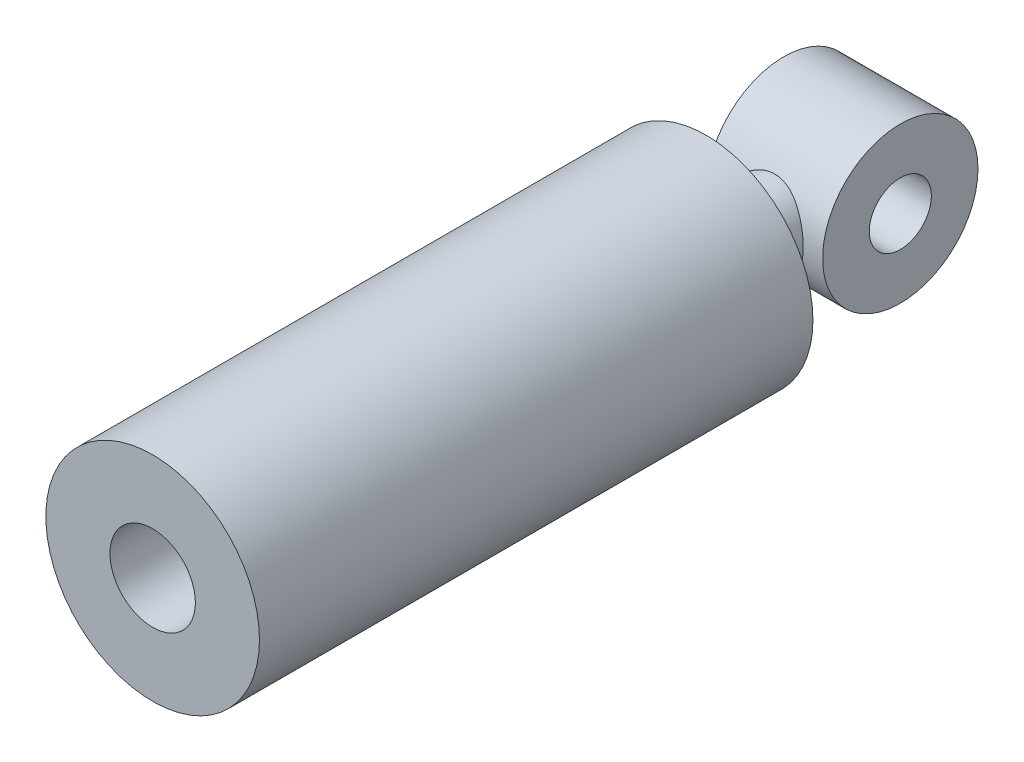
ISO-10303-21;
HEADER;
FILE_DESCRIPTION(('STEP AP214'),'2;1');
FILE_NAME('part.step','',(''),(''),'','','');
FILE_SCHEMA(('AUTOMOTIVE_DESIGN { 1 0 10303 214 1 1 1 1 }'));
ENDSEC;
DATA;
#1=APPLICATION_CONTEXT('core data for automotive mechanical design processes');
#2=APPLICATION_PROTOCOL_DEFINITION('international standard','automotive_design',2000,#1);
#3=PRODUCT_CONTEXT('',#1,'mechanical');
#4=PRODUCT('Part','Part','',(#3));
#5=PRODUCT_RELATED_PRODUCT_CATEGORY('part','',(#4));
#6=PRODUCT_DEFINITION_FORMATION('','',#4);
#7=PRODUCT_DEFINITION_CONTEXT('part definition',#1,'design');
#8=PRODUCT_DEFINITION('design','',#6,#7);
#9=PRODUCT_DEFINITION_SHAPE('','',#8);
#10=(LENGTH_UNIT() NAMED_UNIT(*) SI_UNIT(.MILLI.,.METRE.));
#11=(NAMED_UNIT(*) PLANE_ANGLE_UNIT() SI_UNIT($,.RADIAN.));
#12=(NAMED_UNIT(*) SI_UNIT($,.STERADIAN.) SOLID_ANGLE_UNIT());
#13=UNCERTAINTY_MEASURE_WITH_UNIT(LENGTH_MEASURE(1.E-05),#10,'distance_accuracy_value','');
#14=(GEOMETRIC_REPRESENTATION_CONTEXT(3) GLOBAL_UNCERTAINTY_ASSIGNED_CONTEXT((#13)) GLOBAL_UNIT_ASSIGNED_CONTEXT((#10,
#11,#12)) REPRESENTATION_CONTEXT('',''));
#15=CARTESIAN_POINT('',(0.,0.,0.));
#16=DIRECTION('',(0.,0.,1.));
#17=DIRECTION('',(1.,0.,0.));
#18=AXIS2_PLACEMENT_3D('',#15,#16,#17);
#19=CARTESIAN_POINT('',(0.,0.,10.123));
#20=DIRECTION('',(0.,0.,1.));
#21=DIRECTION('',(1.,0.,0.));
#22=AXIS2_PLACEMENT_3D('',#19,#20,#21);
#23=CYLINDRICAL_SURFACE('',#22,2.);
#24=CARTESIAN_POINT('',(0.,0.,7.));
#25=DIRECTION('',(0.,0.,1.));
#26=DIRECTION('',(1.,0.,0.));
#27=AXIS2_PLACEMENT_3D('',#24,#25,#26);
#28=CIRCLE('',#27,2.);
#29=CARTESIAN_POINT('',(2.,0.,7.));
#30=VERTEX_POINT('',#29);
#31=EDGE_CURVE('E10',#30,#30,#28,.T.);
#32=ORIENTED_EDGE('',*,*,#31,.F.);
#33=EDGE_LOOP('',(#32));
#34=FACE_BOUND('',#33,.T.);
#35=CARTESIAN_POINT('',(2.,0.,4.));
#36=CARTESIAN_POINT('',(1.99999339536562,0.105143925902467,3.99999426810082));
#37=CARTESIAN_POINT('',(1.99165985375789,0.210413199395125,3.99580982039513));
#38=CARTESIAN_POINT('',(1.95869423931692,0.417840470537792,3.97948312074314));
#39=CARTESIAN_POINT('',(1.93403121400437,0.519992173427259,3.96732575657839));
#40=CARTESIAN_POINT('',(1.86961238276674,0.717867089760898,3.93632558806751));
#41=CARTESIAN_POINT('',(1.82991523150406,0.813613605878292,3.91750878355075));
#42=CARTESIAN_POINT('',(1.73685875727003,0.996945233613197,3.87491553031523));
#43=CARTESIAN_POINT('',(1.68350051150227,1.08453098798012,3.8511394726705));
#44=CARTESIAN_POINT('',(1.56096550102943,1.25501563552382,3.79912516516124));
#45=CARTESIAN_POINT('',(1.49102704152072,1.33731042224422,3.77070398255074));
#46=CARTESIAN_POINT('',(1.33895704150593,1.48955888973396,3.71319940493486));
#47=CARTESIAN_POINT('',(1.25681629645512,1.55950316621353,3.68411552418069));
#48=CARTESIAN_POINT('',(1.07503330095324,1.69050400090056,3.62597902394695));
#49=CARTESIAN_POINT('',(0.974527803308175,1.75045067110327,3.59710373940264));
#50=CARTESIAN_POINT('',(0.763265328027571,1.85233645378139,3.54571957544641));
#51=CARTESIAN_POINT('',(0.652515742554502,1.89428842993267,3.52320615213979));
#52=CARTESIAN_POINT('',(0.430669789156155,1.95626488437718,3.48915734075617));
#53=CARTESIAN_POINT('',(0.319991095865212,1.97745171416088,3.47704543167427));
#54=CARTESIAN_POINT('',(0.0960423244410466,2.00085398661769,3.46363779897055));
#55=CARTESIAN_POINT('',(-0.0172250817423092,2.00308817674615,3.46233138686576));
#56=CARTESIAN_POINT('',(-0.228572048630736,1.98937457434459,3.47021860514497));
#57=CARTESIAN_POINT('',(-0.3268480624461,1.97556911907364,3.47817527324027));
#58=CARTESIAN_POINT('',(-0.519443818746084,1.93387969811386,3.50152457467701));
#59=CARTESIAN_POINT('',(-0.613762290610631,1.9059912477953,3.51691957663553));
#60=CARTESIAN_POINT('',(-0.798458265131318,1.83641956077201,3.55374952825482));
#61=CARTESIAN_POINT('',(-0.888692797571577,1.79443013423199,3.57531681327997));
#62=CARTESIAN_POINT('',(-1.06126858518002,1.698083375336,3.62206808562807));
#63=CARTESIAN_POINT('',(-1.14360627120018,1.64372048762493,3.64725369560381));
#64=CARTESIAN_POINT('',(-1.30904250548645,1.51613210982558,3.70226315806572));
#65=CARTESIAN_POINT('',(-1.39091374715231,1.44138891673856,3.73227020473492));
#66=CARTESIAN_POINT('',(-1.5414708371818,1.27911115748275,3.79095246600814));
#67=CARTESIAN_POINT('',(-1.61015038406777,1.19157051314857,3.81962703917602));
#68=CARTESIAN_POINT('',(-1.73537132205945,1.0010330116637,3.87403974565928));
#69=CARTESIAN_POINT('',(-1.79120094489148,0.897507183198818,3.89957968324015));
#70=CARTESIAN_POINT('',(-1.88419405808602,0.680932430977594,3.94315762242485));
#71=CARTESIAN_POINT('',(-1.92137237003033,0.567891152530552,3.96120157887106));
#72=CARTESIAN_POINT('',(-1.97295080743335,0.345532983321405,3.98648667482871));
#73=CARTESIAN_POINT('',(-1.98898247149356,0.236683061096652,3.9944987660262));
#74=CARTESIAN_POINT('',(-2.00292946226897,0.0175591998987033,4.00146026918207));
#75=CARTESIAN_POINT('',(-2.00085337127894,-0.0927140397398172,4.00041397442637));
#76=CARTESIAN_POINT('',(-1.97958662316251,-0.302465943971974,3.9898238450687));
#77=CARTESIAN_POINT('',(-1.96173493454001,-0.40211881609986,3.98094491376337));
#78=CARTESIAN_POINT('',(-1.91152385620976,-0.596813784603882,3.9564434262968));
#79=CARTESIAN_POINT('',(-1.87916286709301,-0.691855371382174,3.94082012668824));
#80=CARTESIAN_POINT('',(-1.80000306713393,-0.877777216899145,3.90368502827176));
#81=CARTESIAN_POINT('',(-1.75281789976743,-0.968460794011607,3.88201763539261));
#82=CARTESIAN_POINT('',(-1.64578492870686,-1.14092272339854,3.83487948634835));
#83=CARTESIAN_POINT('',(-1.58593173080921,-1.22269725955318,3.80940711133877));
#84=CARTESIAN_POINT('',(-1.44847914933857,-1.38353537857843,3.75416442672396));
#85=CARTESIAN_POINT('',(-1.36971426310971,-1.46154415563805,3.72421769686998));
#86=CARTESIAN_POINT('',(-1.20014969744454,-1.60371264223771,3.6652478321764));
#87=CARTESIAN_POINT('',(-1.10934176230416,-1.66786277142375,3.63622534800094));
#88=CARTESIAN_POINT('',(-0.912712691654048,-1.78341582895804,3.58102384412979));
#89=CARTESIAN_POINT('',(-0.806377467811037,-1.8340509916005,3.55505059178121));
#90=CARTESIAN_POINT('',(-0.584979864850068,-1.91616565186941,3.51148144588269));
#91=CARTESIAN_POINT('',(-0.469928947066219,-1.94766983173403,3.493874764435));
#92=CARTESIAN_POINT('',(-0.246179554230592,-1.98772337493374,3.47123002051604));
#93=CARTESIAN_POINT('',(-0.137931493129517,-1.9981859928109,3.4651476693013));
#94=CARTESIAN_POINT('',(0.0788941343290494,-2.0013783087524,3.46330709283206));
#95=CARTESIAN_POINT('',(0.187471537475723,-1.99411569324648,3.4675443925278));
#96=CARTESIAN_POINT('',(0.390967003066874,-1.96385225118662,3.48475724102153));
#97=CARTESIAN_POINT('',(0.486200940289479,-1.94241662868607,3.49686188965317));
#98=CARTESIAN_POINT('',(0.671616238848733,-1.88635071644882,3.52742032375305));
#99=CARTESIAN_POINT('',(0.761795964184063,-1.85171618231984,3.54587615139337));
#100=CARTESIAN_POINT('',(0.941249701973074,-1.76763149060113,3.58857060729071));
#101=CARTESIAN_POINT('',(1.03005580365806,-1.7173422756314,3.61311444791841));
#102=CARTESIAN_POINT('',(1.19854907236252,-1.60430194327478,3.66470663269721));
#103=CARTESIAN_POINT('',(1.27823146104222,-1.54154434248312,3.69175627591221));
#104=CARTESIAN_POINT('',(1.43628396470935,-1.39640665332275,3.74924646316184));
#105=CARTESIAN_POINT('',(1.51331820470058,-1.31256884599452,3.77969966613256));
#106=CARTESIAN_POINT('',(1.65252596687054,-1.13230961246639,3.83755504519861));
#107=CARTESIAN_POINT('',(1.71469147893981,-1.03588144661039,3.8649555725239));
#108=CARTESIAN_POINT('',(1.82247272542414,-0.831863193565891,3.91396019133075));
#109=CARTESIAN_POINT('',(1.86796833847294,-0.72419900755346,3.93552192987866));
#110=CARTESIAN_POINT('',(1.93961633551482,-0.501484202276172,3.97002682597974));
#111=CARTESIAN_POINT('',(1.96582369361143,-0.3864555991782,3.98299446726136));
#112=CARTESIAN_POINT('',(1.98779482217148,-0.22520389298179,3.99390923826956));
#113=CARTESIAN_POINT('',(1.99236528173268,-0.18032375888313,3.99618730680502));
#114=CARTESIAN_POINT('',(1.99846933102817,-0.0903034636101831,3.99923393953631));
#115=CARTESIAN_POINT('',(2.00000283694042,-0.0451632952932568,4.00000246206762));
#116=CARTESIAN_POINT('',(2.,0.,4.));
#117=B_SPLINE_CURVE_WITH_KNOTS('',3,(#35,#36,#37,#38,#39,#40,#41,#42,#43,#44,#45,#46,#47,#48,
#49,#50,#51,#52,#53,#54,#55,#56,#57,#58,#59,#60,#61,#62,#63,#64,#65,#66,#67,#68,#69,#70,#71,#72,
#73,#74,#75,#76,#77,#78,#79,#80,#81,#82,#83,#84,#85,#86,#87,#88,#89,#90,#91,#92,#93,#94,#95,#96,
#97,#98,#99,#100,#101,#102,#103,#104,#105,#106,#107,#108,#109,#110,#111,#112,#113,#114,#115,
#116),.UNSPECIFIED.,.T.,.F.,(4,2,2,2,2,2,2,2,2,2,2,2,2,2,2,2,2,2,2,2,2,2,2,2,2,2,2,2,2,2,2,2,2,
2,2,2,2,2,2,2,4),(0.,0.315248514840585,0.631096299418395,0.945724310984597,1.26032752116314,
1.59396351743618,1.92785247530807,2.28763452861505,2.64715895796562,2.98516024280459,
3.32282714658041,3.62011424818641,3.91749607851357,4.22180480336975,4.52625042520444,
4.86929882667757,5.21251069197373,5.57166044428881,5.93052433824559,6.25966580942691,
6.58865129022952,6.89213813012244,7.19565843261863,7.50785712055797,7.82018901496679,
8.16319221288838,8.50643177230864,8.86629364323452,9.22569023890902,9.55058615006093,
9.87534119729357,10.1691586049771,10.463070575767,10.7767291356057,11.0905512228726,
11.4425048551434,11.7946476676249,12.1492802732705,12.502898172423,12.6383056026783,
12.7737167702213),.UNSPECIFIED.);
#118=CARTESIAN_POINT('',(2.,0.,4.));
#119=VERTEX_POINT('',#118);
#120=EDGE_CURVE('E40',#119,#119,#117,.T.);
#121=ORIENTED_EDGE('',*,*,#120,.T.);
#122=EDGE_LOOP('',(#121));
#123=FACE_BOUND('',#122,.T.);
#124=ADVANCED_FACE('F36',(#34,#123),#23,.T.);
#125=CARTESIAN_POINT('',(2.,0.,7.));
#126=DIRECTION('',(0.,0.,-1.));
#127=DIRECTION('',(-1.,0.,0.));
#128=AXIS2_PLACEMENT_3D('',#125,#126,#127);
#129=PLANE('',#128);
#130=ORIENTED_EDGE('',*,*,#31,.T.);
#131=EDGE_LOOP('',(#130));
#132=FACE_BOUND('',#131,.T.);
#133=CARTESIAN_POINT('',(0.,0.,7.));
#134=DIRECTION('',(0.,0.,1.));
#135=DIRECTION('',(1.,0.,0.));
#136=AXIS2_PLACEMENT_3D('',#133,#134,#135);
#137=CIRCLE('',#136,5.5);
#138=CARTESIAN_POINT('',(5.5,0.,7.));
#139=VERTEX_POINT('',#138);
#140=EDGE_CURVE('E48',#139,#139,#137,.T.);
#141=ORIENTED_EDGE('',*,*,#140,.F.);
#142=EDGE_LOOP('',(#141));
#143=FACE_BOUND('',#142,.T.);
#144=ADVANCED_FACE('F102',(#132,#143),#129,.T.);
#145=CARTESIAN_POINT('',(0.,0.,10.123));
#146=DIRECTION('',(0.,0.,1.));
#147=DIRECTION('',(1.,0.,0.));
#148=AXIS2_PLACEMENT_3D('',#145,#146,#147);
#149=CYLINDRICAL_SURFACE('',#148,5.5);
#150=ORIENTED_EDGE('',*,*,#140,.T.);
#151=EDGE_LOOP('',(#150));
#152=FACE_BOUND('',#151,.T.);
#153=CARTESIAN_POINT('',(0.,0.,35.5));
#154=DIRECTION('',(0.,0.,1.));
#155=DIRECTION('',(1.,0.,0.));
#156=AXIS2_PLACEMENT_3D('',#153,#154,#155);
#157=CIRCLE('',#156,5.5);
#158=CARTESIAN_POINT('',(5.5,0.,35.5));
#159=VERTEX_POINT('',#158);
#160=EDGE_CURVE('E52',#159,#159,#157,.T.);
#161=ORIENTED_EDGE('',*,*,#160,.F.);
#162=EDGE_LOOP('',(#161));
#163=FACE_BOUND('',#162,.T.);
#164=ADVANCED_FACE('F107',(#152,#163),#149,.T.);
#165=CARTESIAN_POINT('',(5.5,0.,35.5));
#166=DIRECTION('',(0.,0.,1.));
#167=DIRECTION('',(1.,0.,0.));
#168=AXIS2_PLACEMENT_3D('',#165,#166,#167);
#169=PLANE('',#168);
#170=ORIENTED_EDGE('',*,*,#160,.T.);
#171=EDGE_LOOP('',(#170));
#172=FACE_BOUND('',#171,.T.);
#173=CARTESIAN_POINT('',(0.,0.,35.5));
#174=DIRECTION('',(0.,0.,1.));
#175=DIRECTION('',(1.,0.,0.));
#176=AXIS2_PLACEMENT_3D('',#173,#174,#175);
#177=CIRCLE('',#176,2.2);
#178=CARTESIAN_POINT('',(2.2,0.,35.5));
#179=VERTEX_POINT('',#178);
#180=EDGE_CURVE('E57',#179,#179,#177,.T.);
#181=ORIENTED_EDGE('',*,*,#180,.F.);
#182=EDGE_LOOP('',(#181));
#183=FACE_BOUND('',#182,.T.);
#184=ADVANCED_FACE('F114',(#172,#183),#169,.T.);
#185=CARTESIAN_POINT('',(0.,0.,10.123));
#186=DIRECTION('',(0.,0.,1.));
#187=DIRECTION('',(1.,0.,0.));
#188=AXIS2_PLACEMENT_3D('',#185,#186,#187);
#189=CYLINDRICAL_SURFACE('',#188,2.2);
#190=ORIENTED_EDGE('',*,*,#180,.T.);
#191=EDGE_LOOP('',(#190));
#192=FACE_BOUND('',#191,.T.);
#193=CARTESIAN_POINT('',(0.,0.,12.));
#194=DIRECTION('',(0.,0.,1.));
#195=DIRECTION('',(1.,0.,0.));
#196=AXIS2_PLACEMENT_3D('',#193,#194,#195);
#197=CIRCLE('',#196,2.2);
#198=CARTESIAN_POINT('',(2.2,0.,12.));
#199=VERTEX_POINT('',#198);
#200=EDGE_CURVE('E60',#199,#199,#197,.T.);
#201=ORIENTED_EDGE('',*,*,#200,.F.);
#202=EDGE_LOOP('',(#201));
#203=FACE_BOUND('',#202,.T.);
#204=ADVANCED_FACE('F121',(#192,#203),#189,.F.);
#205=CARTESIAN_POINT('',(2.2,0.,12.));
#206=DIRECTION('',(0.,0.,1.));
#207=DIRECTION('',(1.,0.,0.));
#208=AXIS2_PLACEMENT_3D('',#205,#206,#207);
#209=PLANE('',#208);
#210=ORIENTED_EDGE('',*,*,#200,.T.);
#211=EDGE_LOOP('',(#210));
#212=FACE_BOUND('',#211,.T.);
#213=ADVANCED_FACE('F94',(#212),#209,.T.);
#214=CARTESIAN_POINT('',(3.,0.,0.));
#215=DIRECTION('',(-1.,0.,0.));
#216=DIRECTION('',(0.,0.,1.));
#217=AXIS2_PLACEMENT_3D('',#214,#215,#216);
#218=CYLINDRICAL_SURFACE('',#217,4.);
#219=ORIENTED_EDGE('',*,*,#120,.F.);
#220=EDGE_LOOP('',(#219));
#221=FACE_BOUND('',#220,.T.);
#222=CARTESIAN_POINT('',(3.,0.,0.));
#223=DIRECTION('',(1.,0.,0.));
#224=DIRECTION('',(0.,0.,-1.));
#225=AXIS2_PLACEMENT_3D('',#222,#223,#224);
#226=CIRCLE('',#225,4.);
#227=CARTESIAN_POINT('',(3.,0.,-4.));
#228=VERTEX_POINT('',#227);
#229=EDGE_CURVE('E66',#228,#228,#226,.T.);
#230=ORIENTED_EDGE('',*,*,#229,.F.);
#231=EDGE_LOOP('',(#230));
#232=FACE_BOUND('',#231,.T.);
#233=CARTESIAN_POINT('',(-3.,0.,0.));
#234=DIRECTION('',(1.,0.,0.));
#235=DIRECTION('',(0.,0.,-1.));
#236=AXIS2_PLACEMENT_3D('',#233,#234,#235);
#237=CIRCLE('',#236,4.);
#238=CARTESIAN_POINT('',(-3.,0.,-4.));
#239=VERTEX_POINT('',#238);
#240=EDGE_CURVE('E63',#239,#239,#237,.T.);
#241=ORIENTED_EDGE('',*,*,#240,.T.);
#242=EDGE_LOOP('',(#241));
#243=FACE_BOUND('',#242,.T.);
#244=ADVANCED_FACE('F88',(#221,#232,#243),#218,.T.);
#245=CARTESIAN_POINT('',(3.,0.,0.));
#246=DIRECTION('',(1.,0.,0.));
#247=DIRECTION('',(0.,0.,-1.));
#248=AXIS2_PLACEMENT_3D('',#245,#246,#247);
#249=PLANE('',#248);
#250=CARTESIAN_POINT('',(3.,0.,0.));
#251=DIRECTION('',(1.,0.,0.));
#252=DIRECTION('',(0.,0.,-1.));
#253=AXIS2_PLACEMENT_3D('',#250,#251,#252);
#254=CIRCLE('',#253,1.6);
#255=CARTESIAN_POINT('',(3.,0.,-1.6));
#256=VERTEX_POINT('',#255);
#257=EDGE_CURVE('E70',#256,#256,#254,.T.);
#258=ORIENTED_EDGE('',*,*,#257,.F.);
#259=EDGE_LOOP('',(#258));
#260=FACE_BOUND('',#259,.T.);
#261=ORIENTED_EDGE('',*,*,#229,.T.);
#262=EDGE_LOOP('',(#261));
#263=FACE_BOUND('',#262,.T.);
#264=ADVANCED_FACE('F85',(#260,#263),#249,.T.);
#265=CARTESIAN_POINT('',(-3.,0.,0.));
#266=DIRECTION('',(1.,0.,0.));
#267=DIRECTION('',(0.,0.,-1.));
#268=AXIS2_PLACEMENT_3D('',#265,#266,#267);
#269=PLANE('',#268);
#270=CARTESIAN_POINT('',(-3.,0.,0.));
#271=DIRECTION('',(1.,0.,0.));
#272=DIRECTION('',(0.,0.,-1.));
#273=AXIS2_PLACEMENT_3D('',#270,#271,#272);
#274=CIRCLE('',#273,1.6);
#275=CARTESIAN_POINT('',(-3.,0.,-1.6));
#276=VERTEX_POINT('',#275);
#277=EDGE_CURVE('E67',#276,#276,#274,.T.);
#278=ORIENTED_EDGE('',*,*,#277,.T.);
#279=EDGE_LOOP('',(#278));
#280=FACE_BOUND('',#279,.T.);
#281=ORIENTED_EDGE('',*,*,#240,.F.);
#282=EDGE_LOOP('',(#281));
#283=FACE_BOUND('',#282,.T.);
#284=ADVANCED_FACE('F76',(#280,#283),#269,.F.);
#285=CARTESIAN_POINT('',(-3.,0.,0.));
#286=DIRECTION('',(1.,0.,0.));
#287=DIRECTION('',(0.,0.,-1.));
#288=AXIS2_PLACEMENT_3D('',#285,#286,#287);
#289=CYLINDRICAL_SURFACE('',#288,1.6);
#290=ORIENTED_EDGE('',*,*,#277,.F.);
#291=EDGE_LOOP('',(#290));
#292=FACE_BOUND('',#291,.T.);
#293=ORIENTED_EDGE('',*,*,#257,.T.);
#294=EDGE_LOOP('',(#293));
#295=FACE_BOUND('',#294,.T.);
#296=ADVANCED_FACE('F79',(#292,#295),#289,.F.);
#297=CLOSED_SHELL('',(#124,#144,#164,#184,#204,#213,#244,#264,#284,#296));
#298=MANIFOLD_SOLID_BREP('B2',#297);
#299=ADVANCED_BREP_SHAPE_REPRESENTATION('',(#18,#298),#14);
#300=SHAPE_DEFINITION_REPRESENTATION(#9,#299);
ENDSEC;
END-ISO-10303-21;
